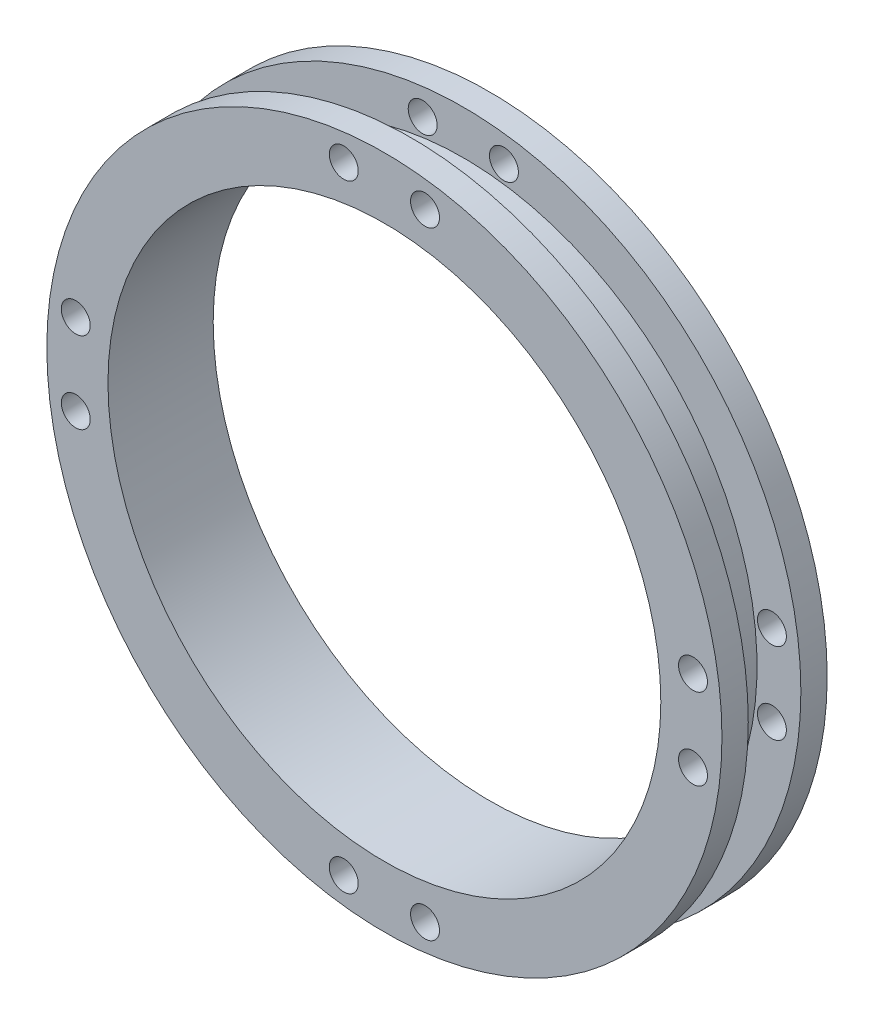
ISO-10303-21;
HEADER;
FILE_DESCRIPTION(('STEP AP214'),'2;1');
FILE_NAME('part.step','',(''),(''),'','','');
FILE_SCHEMA(('AUTOMOTIVE_DESIGN { 1 0 10303 214 1 1 1 1 }'));
ENDSEC;
DATA;
#1=APPLICATION_CONTEXT('core data for automotive mechanical design processes');
#2=APPLICATION_PROTOCOL_DEFINITION('international standard','automotive_design',2000,#1);
#3=PRODUCT_CONTEXT('',#1,'mechanical');
#4=PRODUCT('Part','Part','',(#3));
#5=PRODUCT_RELATED_PRODUCT_CATEGORY('part','',(#4));
#6=PRODUCT_DEFINITION_FORMATION('','',#4);
#7=PRODUCT_DEFINITION_CONTEXT('part definition',#1,'design');
#8=PRODUCT_DEFINITION('design','',#6,#7);
#9=PRODUCT_DEFINITION_SHAPE('','',#8);
#10=(LENGTH_UNIT() NAMED_UNIT(*) SI_UNIT(.MILLI.,.METRE.));
#11=(NAMED_UNIT(*) PLANE_ANGLE_UNIT() SI_UNIT($,.RADIAN.));
#12=(NAMED_UNIT(*) SI_UNIT($,.STERADIAN.) SOLID_ANGLE_UNIT());
#13=UNCERTAINTY_MEASURE_WITH_UNIT(LENGTH_MEASURE(1.E-05),#10,'distance_accuracy_value','');
#14=(GEOMETRIC_REPRESENTATION_CONTEXT(3) GLOBAL_UNCERTAINTY_ASSIGNED_CONTEXT((#13)) GLOBAL_UNIT_ASSIGNED_CONTEXT((#10,
#11,#12)) REPRESENTATION_CONTEXT('',''));
#15=CARTESIAN_POINT('',(0.,0.,0.));
#16=DIRECTION('',(0.,0.,1.));
#17=DIRECTION('',(1.,0.,0.));
#18=AXIS2_PLACEMENT_3D('',#15,#16,#17);
#19=CARTESIAN_POINT('',(0.,0.,9.));
#20=DIRECTION('',(0.,0.,1.));
#21=DIRECTION('',(1.,0.,0.));
#22=AXIS2_PLACEMENT_3D('',#19,#20,#21);
#23=PLANE('',#22);
#24=CARTESIAN_POINT('',(0.,0.,9.));
#25=DIRECTION('',(0.,0.,1.));
#26=DIRECTION('',(1.,0.,0.));
#27=AXIS2_PLACEMENT_3D('',#24,#25,#26);
#28=CIRCLE('',#27,31.525);
#29=CARTESIAN_POINT('',(31.525,0.,9.));
#30=VERTEX_POINT('',#29);
#31=EDGE_CURVE('E156',#30,#30,#28,.T.);
#32=ORIENTED_EDGE('',*,*,#31,.F.);
#33=EDGE_LOOP('',(#32));
#34=FACE_BOUND('',#33,.T.);
#35=CARTESIAN_POINT('',(-35.1962925787703,-4.63367982381147,9.));
#36=DIRECTION('',(0.,0.,-1.));
#37=DIRECTION('',(-1.,0.,0.));
#38=AXIS2_PLACEMENT_3D('',#35,#36,#37);
#39=CIRCLE('',#38,1.65);
#40=CARTESIAN_POINT('',(-36.8462925787703,-4.63367982381147,9.));
#41=VERTEX_POINT('',#40);
#42=EDGE_CURVE('E141',#41,#41,#39,.T.);
#43=ORIENTED_EDGE('',*,*,#42,.T.);
#44=EDGE_LOOP('',(#43));
#45=FACE_BOUND('',#44,.T.);
#46=CARTESIAN_POINT('',(-4.63367982381187,-35.1962925787703,9.));
#47=DIRECTION('',(0.,0.,-1.));
#48=DIRECTION('',(-1.,0.,0.));
#49=AXIS2_PLACEMENT_3D('',#46,#47,#48);
#50=CIRCLE('',#49,1.65);
#51=CARTESIAN_POINT('',(-6.28367982381186,-35.1962925787703,9.));
#52=VERTEX_POINT('',#51);
#53=EDGE_CURVE('E129',#52,#52,#50,.T.);
#54=ORIENTED_EDGE('',*,*,#53,.T.);
#55=EDGE_LOOP('',(#54));
#56=FACE_BOUND('',#55,.T.);
#57=CARTESIAN_POINT('',(4.63367982381184,-35.1962925787703,9.));
#58=DIRECTION('',(0.,0.,-1.));
#59=DIRECTION('',(-1.,0.,0.));
#60=AXIS2_PLACEMENT_3D('',#57,#58,#59);
#61=CIRCLE('',#60,1.65);
#62=CARTESIAN_POINT('',(2.98367982381184,-35.1962925787703,9.));
#63=VERTEX_POINT('',#62);
#64=EDGE_CURVE('E117',#63,#63,#61,.T.);
#65=ORIENTED_EDGE('',*,*,#64,.T.);
#66=EDGE_LOOP('',(#65));
#67=FACE_BOUND('',#66,.T.);
#68=CARTESIAN_POINT('',(35.1962925787703,-4.63367982381199,9.));
#69=DIRECTION('',(0.,0.,-1.));
#70=DIRECTION('',(-1.,0.,0.));
#71=AXIS2_PLACEMENT_3D('',#68,#69,#70);
#72=CIRCLE('',#71,1.65);
#73=CARTESIAN_POINT('',(33.5462925787702,-4.63367982381199,9.));
#74=VERTEX_POINT('',#73);
#75=EDGE_CURVE('E105',#74,#74,#72,.T.);
#76=ORIENTED_EDGE('',*,*,#75,.T.);
#77=EDGE_LOOP('',(#76));
#78=FACE_BOUND('',#77,.T.);
#79=CARTESIAN_POINT('',(35.1962925787703,4.63367982381172,9.));
#80=DIRECTION('',(0.,0.,-1.));
#81=DIRECTION('',(-1.,0.,0.));
#82=AXIS2_PLACEMENT_3D('',#79,#80,#81);
#83=CIRCLE('',#82,1.65);
#84=CARTESIAN_POINT('',(33.5462925787703,4.63367982381172,9.));
#85=VERTEX_POINT('',#84);
#86=EDGE_CURVE('E93',#85,#85,#83,.T.);
#87=ORIENTED_EDGE('',*,*,#86,.T.);
#88=EDGE_LOOP('',(#87));
#89=FACE_BOUND('',#88,.T.);
#90=CARTESIAN_POINT('',(4.63367982381187,35.1962925787703,9.));
#91=DIRECTION('',(0.,0.,-1.));
#92=DIRECTION('',(-1.,0.,0.));
#93=AXIS2_PLACEMENT_3D('',#90,#91,#92);
#94=CIRCLE('',#93,1.65);
#95=CARTESIAN_POINT('',(2.98367982381187,35.1962925787703,9.));
#96=VERTEX_POINT('',#95);
#97=EDGE_CURVE('E81',#96,#96,#94,.T.);
#98=ORIENTED_EDGE('',*,*,#97,.T.);
#99=EDGE_LOOP('',(#98));
#100=FACE_BOUND('',#99,.T.);
#101=CARTESIAN_POINT('',(-4.63367982381184,35.1962925787703,9.));
#102=DIRECTION('',(0.,0.,-1.));
#103=DIRECTION('',(-1.,0.,0.));
#104=AXIS2_PLACEMENT_3D('',#101,#102,#103);
#105=CIRCLE('',#104,1.65);
#106=CARTESIAN_POINT('',(-6.28367982381184,35.1962925787703,9.));
#107=VERTEX_POINT('',#106);
#108=EDGE_CURVE('E69',#107,#107,#105,.T.);
#109=ORIENTED_EDGE('',*,*,#108,.T.);
#110=EDGE_LOOP('',(#109));
#111=FACE_BOUND('',#110,.T.);
#112=CARTESIAN_POINT('',(0.,0.,9.));
#113=DIRECTION('',(0.,0.,1.));
#114=DIRECTION('',(1.,0.,0.));
#115=AXIS2_PLACEMENT_3D('',#112,#113,#114);
#116=CIRCLE('',#115,38.5);
#117=CARTESIAN_POINT('',(38.5,0.,9.));
#118=VERTEX_POINT('',#117);
#119=EDGE_CURVE('E58',#118,#118,#116,.T.);
#120=ORIENTED_EDGE('',*,*,#119,.T.);
#121=EDGE_LOOP('',(#120));
#122=FACE_BOUND('',#121,.T.);
#123=CARTESIAN_POINT('',(-35.1962925787702,4.63367982381223,9.));
#124=DIRECTION('',(0.,0.,-1.));
#125=DIRECTION('',(-1.,0.,0.));
#126=AXIS2_PLACEMENT_3D('',#123,#124,#125);
#127=CIRCLE('',#126,1.65);
#128=CARTESIAN_POINT('',(-36.8462925787702,4.63367982381223,9.));
#129=VERTEX_POINT('',#128);
#130=EDGE_CURVE('E150',#129,#129,#127,.T.);
#131=ORIENTED_EDGE('',*,*,#130,.T.);
#132=EDGE_LOOP('',(#131));
#133=FACE_BOUND('',#132,.T.);
#134=ADVANCED_FACE('F37',(#34,#45,#56,#67,#78,#89,#100,#111,#122,#133),#23,.T.);
#135=CARTESIAN_POINT('',(0.,0.,-3.));
#136=DIRECTION('',(0.,0.,1.));
#137=DIRECTION('',(1.,0.,0.));
#138=AXIS2_PLACEMENT_3D('',#135,#136,#137);
#139=PLANE('',#138);
#140=CARTESIAN_POINT('',(0.,0.,-3.));
#141=DIRECTION('',(0.,0.,-1.));
#142=DIRECTION('',(-1.,0.,0.));
#143=AXIS2_PLACEMENT_3D('',#140,#141,#142);
#144=CIRCLE('',#143,31.525);
#145=CARTESIAN_POINT('',(-31.525,0.,-3.));
#146=VERTEX_POINT('',#145);
#147=EDGE_CURVE('E159',#146,#146,#144,.T.);
#148=ORIENTED_EDGE('',*,*,#147,.F.);
#149=EDGE_LOOP('',(#148));
#150=FACE_BOUND('',#149,.T.);
#151=CARTESIAN_POINT('',(-35.1962925787703,-4.63367982381147,-3.));
#152=DIRECTION('',(0.,0.,-1.));
#153=DIRECTION('',(-1.,0.,0.));
#154=AXIS2_PLACEMENT_3D('',#151,#152,#153);
#155=CIRCLE('',#154,1.64999999999999);
#156=CARTESIAN_POINT('',(-36.8462925787703,-4.63367982381147,-3.));
#157=VERTEX_POINT('',#156);
#158=EDGE_CURVE('E144',#157,#157,#155,.T.);
#159=ORIENTED_EDGE('',*,*,#158,.F.);
#160=EDGE_LOOP('',(#159));
#161=FACE_BOUND('',#160,.T.);
#162=CARTESIAN_POINT('',(4.63367982381184,-35.1962925787703,-3.));
#163=DIRECTION('',(0.,0.,-1.));
#164=DIRECTION('',(-1.,0.,0.));
#165=AXIS2_PLACEMENT_3D('',#162,#163,#164);
#166=CIRCLE('',#165,1.64999999999999);
#167=CARTESIAN_POINT('',(2.98367982381185,-35.1962925787703,-3.));
#168=VERTEX_POINT('',#167);
#169=EDGE_CURVE('E120',#168,#168,#166,.T.);
#170=ORIENTED_EDGE('',*,*,#169,.F.);
#171=EDGE_LOOP('',(#170));
#172=FACE_BOUND('',#171,.T.);
#173=CARTESIAN_POINT('',(35.1962925787703,-4.63367982381199,-3.));
#174=DIRECTION('',(0.,0.,-1.));
#175=DIRECTION('',(-1.,0.,0.));
#176=AXIS2_PLACEMENT_3D('',#173,#174,#175);
#177=CIRCLE('',#176,1.64999999999999);
#178=CARTESIAN_POINT('',(33.5462925787703,-4.63367982381199,-3.));
#179=VERTEX_POINT('',#178);
#180=EDGE_CURVE('E108',#179,#179,#177,.T.);
#181=ORIENTED_EDGE('',*,*,#180,.F.);
#182=EDGE_LOOP('',(#181));
#183=FACE_BOUND('',#182,.T.);
#184=CARTESIAN_POINT('',(35.1962925787703,4.63367982381172,-3.));
#185=DIRECTION('',(0.,0.,-1.));
#186=DIRECTION('',(-1.,0.,0.));
#187=AXIS2_PLACEMENT_3D('',#184,#185,#186);
#188=CIRCLE('',#187,1.64999999999998);
#189=CARTESIAN_POINT('',(33.5462925787703,4.63367982381172,-3.));
#190=VERTEX_POINT('',#189);
#191=EDGE_CURVE('E96',#190,#190,#188,.T.);
#192=ORIENTED_EDGE('',*,*,#191,.F.);
#193=EDGE_LOOP('',(#192));
#194=FACE_BOUND('',#193,.T.);
#195=CARTESIAN_POINT('',(4.63367982381187,35.1962925787703,-3.));
#196=DIRECTION('',(0.,0.,-1.));
#197=DIRECTION('',(-1.,0.,0.));
#198=AXIS2_PLACEMENT_3D('',#195,#196,#197);
#199=CIRCLE('',#198,1.64999999999999);
#200=CARTESIAN_POINT('',(2.98367982381188,35.1962925787703,-3.));
#201=VERTEX_POINT('',#200);
#202=EDGE_CURVE('E84',#201,#201,#199,.T.);
#203=ORIENTED_EDGE('',*,*,#202,.F.);
#204=EDGE_LOOP('',(#203));
#205=FACE_BOUND('',#204,.T.);
#206=CARTESIAN_POINT('',(-4.63367982381184,35.1962925787703,-3.));
#207=DIRECTION('',(0.,0.,-1.));
#208=DIRECTION('',(-1.,0.,0.));
#209=AXIS2_PLACEMENT_3D('',#206,#207,#208);
#210=CIRCLE('',#209,1.64999999999999);
#211=CARTESIAN_POINT('',(-6.28367982381183,35.1962925787703,-3.));
#212=VERTEX_POINT('',#211);
#213=EDGE_CURVE('E72',#212,#212,#210,.T.);
#214=ORIENTED_EDGE('',*,*,#213,.F.);
#215=EDGE_LOOP('',(#214));
#216=FACE_BOUND('',#215,.T.);
#217=CARTESIAN_POINT('',(0.,0.,-3.));
#218=DIRECTION('',(0.,0.,-1.));
#219=DIRECTION('',(-1.,0.,0.));
#220=AXIS2_PLACEMENT_3D('',#217,#218,#219);
#221=CIRCLE('',#220,38.5);
#222=CARTESIAN_POINT('',(-38.5,0.,-3.));
#223=VERTEX_POINT('',#222);
#224=EDGE_CURVE('E52',#223,#223,#221,.T.);
#225=ORIENTED_EDGE('',*,*,#224,.T.);
#226=EDGE_LOOP('',(#225));
#227=FACE_BOUND('',#226,.T.);
#228=CARTESIAN_POINT('',(-4.63367982381187,-35.1962925787703,-3.));
#229=DIRECTION('',(0.,0.,-1.));
#230=DIRECTION('',(-1.,0.,0.));
#231=AXIS2_PLACEMENT_3D('',#228,#229,#230);
#232=CIRCLE('',#231,1.64999999999999);
#233=CARTESIAN_POINT('',(-6.28367982381185,-35.1962925787703,-3.));
#234=VERTEX_POINT('',#233);
#235=EDGE_CURVE('E132',#234,#234,#232,.T.);
#236=ORIENTED_EDGE('',*,*,#235,.F.);
#237=EDGE_LOOP('',(#236));
#238=FACE_BOUND('',#237,.T.);
#239=CARTESIAN_POINT('',(-35.1962925787702,4.63367982381223,-3.));
#240=DIRECTION('',(0.,0.,-1.));
#241=DIRECTION('',(-1.,0.,0.));
#242=AXIS2_PLACEMENT_3D('',#239,#240,#241);
#243=CIRCLE('',#242,1.64999999999998);
#244=CARTESIAN_POINT('',(-36.8462925787702,4.63367982381223,-3.));
#245=VERTEX_POINT('',#244);
#246=EDGE_CURVE('E153',#245,#245,#243,.T.);
#247=ORIENTED_EDGE('',*,*,#246,.F.);
#248=EDGE_LOOP('',(#247));
#249=FACE_BOUND('',#248,.T.);
#250=ADVANCED_FACE('F165',(#150,#161,#172,#183,#194,#205,#216,#227,#238,#249),#139,.F.);
#251=CARTESIAN_POINT('',(0.,0.,9.));
#252=DIRECTION('',(0.,0.,-1.));
#253=DIRECTION('',(-1.,0.,0.));
#254=AXIS2_PLACEMENT_3D('',#251,#252,#253);
#255=CYLINDRICAL_SURFACE('',#254,33.5);
#256=CARTESIAN_POINT('',(0.,0.,0.));
#257=DIRECTION('',(0.,0.,-1.));
#258=DIRECTION('',(-1.,0.,0.));
#259=AXIS2_PLACEMENT_3D('',#256,#257,#258);
#260=CIRCLE('',#259,33.5);
#261=CARTESIAN_POINT('',(-33.5,0.,0.));
#262=VERTEX_POINT('',#261);
#263=EDGE_CURVE('E45',#262,#262,#260,.T.);
#264=ORIENTED_EDGE('',*,*,#263,.F.);
#265=EDGE_LOOP('',(#264));
#266=FACE_BOUND('',#265,.T.);
#267=CARTESIAN_POINT('',(0.,0.,6.));
#268=DIRECTION('',(0.,0.,1.));
#269=DIRECTION('',(1.,0.,0.));
#270=AXIS2_PLACEMENT_3D('',#267,#268,#269);
#271=CIRCLE('',#270,33.5);
#272=CARTESIAN_POINT('',(33.5,0.,6.));
#273=VERTEX_POINT('',#272);
#274=EDGE_CURVE('E10',#273,#273,#271,.T.);
#275=ORIENTED_EDGE('',*,*,#274,.F.);
#276=EDGE_LOOP('',(#275));
#277=FACE_BOUND('',#276,.T.);
#278=ADVANCED_FACE('F39',(#266,#277),#255,.T.);
#279=CARTESIAN_POINT('',(0.,0.,0.));
#280=DIRECTION('',(0.,0.,-1.));
#281=DIRECTION('',(-1.,0.,0.));
#282=AXIS2_PLACEMENT_3D('',#279,#280,#281);
#283=CYLINDRICAL_SURFACE('',#282,38.5);
#284=CARTESIAN_POINT('',(0.,0.,0.));
#285=DIRECTION('',(0.,0.,-1.));
#286=DIRECTION('',(-1.,0.,0.));
#287=AXIS2_PLACEMENT_3D('',#284,#285,#286);
#288=CIRCLE('',#287,38.5);
#289=CARTESIAN_POINT('',(-38.5,0.,0.));
#290=VERTEX_POINT('',#289);
#291=EDGE_CURVE('E49',#290,#290,#288,.T.);
#292=ORIENTED_EDGE('',*,*,#291,.T.);
#293=EDGE_LOOP('',(#292));
#294=FACE_BOUND('',#293,.T.);
#295=ORIENTED_EDGE('',*,*,#224,.F.);
#296=EDGE_LOOP('',(#295));
#297=FACE_BOUND('',#296,.T.);
#298=ADVANCED_FACE('F198',(#294,#297),#283,.T.);
#299=CARTESIAN_POINT('',(0.,0.,0.));
#300=DIRECTION('',(0.,0.,-1.));
#301=DIRECTION('',(-1.,0.,0.));
#302=AXIS2_PLACEMENT_3D('',#299,#300,#301);
#303=PLANE('',#302);
#304=CARTESIAN_POINT('',(-35.1962925787702,4.63367982381223,0.));
#305=DIRECTION('',(0.,0.,-1.));
#306=DIRECTION('',(-1.,0.,0.));
#307=AXIS2_PLACEMENT_3D('',#304,#305,#306);
#308=CIRCLE('',#307,1.64999999999999);
#309=CARTESIAN_POINT('',(-36.8462925787702,4.63367982381223,0.));
#310=VERTEX_POINT('',#309);
#311=EDGE_CURVE('E147',#310,#310,#308,.T.);
#312=ORIENTED_EDGE('',*,*,#311,.T.);
#313=EDGE_LOOP('',(#312));
#314=FACE_BOUND('',#313,.T.);
#315=CARTESIAN_POINT('',(-35.1962925787703,-4.63367982381147,0.));
#316=DIRECTION('',(0.,0.,-1.));
#317=DIRECTION('',(-1.,0.,0.));
#318=AXIS2_PLACEMENT_3D('',#315,#316,#317);
#319=CIRCLE('',#318,1.65);
#320=CARTESIAN_POINT('',(-36.8462925787703,-4.63367982381147,0.));
#321=VERTEX_POINT('',#320);
#322=EDGE_CURVE('E138',#321,#321,#319,.T.);
#323=ORIENTED_EDGE('',*,*,#322,.T.);
#324=EDGE_LOOP('',(#323));
#325=FACE_BOUND('',#324,.T.);
#326=CARTESIAN_POINT('',(-4.63367982381187,-35.1962925787703,0.));
#327=DIRECTION('',(0.,0.,-1.));
#328=DIRECTION('',(-1.,0.,0.));
#329=AXIS2_PLACEMENT_3D('',#326,#327,#328);
#330=CIRCLE('',#329,1.64999999999999);
#331=CARTESIAN_POINT('',(-6.28367982381186,-35.1962925787703,0.));
#332=VERTEX_POINT('',#331);
#333=EDGE_CURVE('E123',#332,#332,#330,.T.);
#334=ORIENTED_EDGE('',*,*,#333,.T.);
#335=EDGE_LOOP('',(#334));
#336=FACE_BOUND('',#335,.T.);
#337=CARTESIAN_POINT('',(4.63367982381184,-35.1962925787703,0.));
#338=DIRECTION('',(0.,0.,-1.));
#339=DIRECTION('',(-1.,0.,0.));
#340=AXIS2_PLACEMENT_3D('',#337,#338,#339);
#341=CIRCLE('',#340,1.64999999999999);
#342=CARTESIAN_POINT('',(2.98367982381185,-35.1962925787703,0.));
#343=VERTEX_POINT('',#342);
#344=EDGE_CURVE('E111',#343,#343,#341,.T.);
#345=ORIENTED_EDGE('',*,*,#344,.T.);
#346=EDGE_LOOP('',(#345));
#347=FACE_BOUND('',#346,.T.);
#348=CARTESIAN_POINT('',(35.1962925787703,-4.63367982381199,0.));
#349=DIRECTION('',(0.,0.,-1.));
#350=DIRECTION('',(-1.,0.,0.));
#351=AXIS2_PLACEMENT_3D('',#348,#349,#350);
#352=CIRCLE('',#351,1.65);
#353=CARTESIAN_POINT('',(33.5462925787703,-4.63367982381199,0.));
#354=VERTEX_POINT('',#353);
#355=EDGE_CURVE('E99',#354,#354,#352,.T.);
#356=ORIENTED_EDGE('',*,*,#355,.T.);
#357=EDGE_LOOP('',(#356));
#358=FACE_BOUND('',#357,.T.);
#359=CARTESIAN_POINT('',(35.1962925787703,4.63367982381172,0.));
#360=DIRECTION('',(0.,0.,-1.));
#361=DIRECTION('',(-1.,0.,0.));
#362=AXIS2_PLACEMENT_3D('',#359,#360,#361);
#363=CIRCLE('',#362,1.64999999999999);
#364=CARTESIAN_POINT('',(33.5462925787703,4.63367982381172,0.));
#365=VERTEX_POINT('',#364);
#366=EDGE_CURVE('E87',#365,#365,#363,.T.);
#367=ORIENTED_EDGE('',*,*,#366,.T.);
#368=EDGE_LOOP('',(#367));
#369=FACE_BOUND('',#368,.T.);
#370=CARTESIAN_POINT('',(4.63367982381187,35.1962925787703,0.));
#371=DIRECTION('',(0.,0.,-1.));
#372=DIRECTION('',(-1.,0.,0.));
#373=AXIS2_PLACEMENT_3D('',#370,#371,#372);
#374=CIRCLE('',#373,1.64999999999999);
#375=CARTESIAN_POINT('',(2.98367982381187,35.1962925787703,0.));
#376=VERTEX_POINT('',#375);
#377=EDGE_CURVE('E78',#376,#376,#374,.T.);
#378=ORIENTED_EDGE('',*,*,#377,.T.);
#379=EDGE_LOOP('',(#378));
#380=FACE_BOUND('',#379,.T.);
#381=CARTESIAN_POINT('',(-4.63367982381184,35.1962925787703,0.));
#382=DIRECTION('',(0.,0.,-1.));
#383=DIRECTION('',(-1.,0.,0.));
#384=AXIS2_PLACEMENT_3D('',#381,#382,#383);
#385=CIRCLE('',#384,1.64999999999999);
#386=CARTESIAN_POINT('',(-6.28367982381183,35.1962925787703,0.));
#387=VERTEX_POINT('',#386);
#388=EDGE_CURVE('E61',#387,#387,#385,.T.);
#389=ORIENTED_EDGE('',*,*,#388,.T.);
#390=EDGE_LOOP('',(#389));
#391=FACE_BOUND('',#390,.T.);
#392=ORIENTED_EDGE('',*,*,#263,.T.);
#393=EDGE_LOOP('',(#392));
#394=FACE_BOUND('',#393,.T.);
#395=ORIENTED_EDGE('',*,*,#291,.F.);
#396=EDGE_LOOP('',(#395));
#397=FACE_BOUND('',#396,.T.);
#398=ADVANCED_FACE('F194',(#314,#325,#336,#347,#358,#369,#380,#391,#394,#397),#303,.F.);
#399=CARTESIAN_POINT('',(0.,0.,6.));
#400=DIRECTION('',(0.,0.,1.));
#401=DIRECTION('',(1.,0.,0.));
#402=AXIS2_PLACEMENT_3D('',#399,#400,#401);
#403=CYLINDRICAL_SURFACE('',#402,38.5);
#404=CARTESIAN_POINT('',(0.,0.,6.));
#405=DIRECTION('',(0.,0.,1.));
#406=DIRECTION('',(1.,0.,0.));
#407=AXIS2_PLACEMENT_3D('',#404,#405,#406);
#408=CIRCLE('',#407,38.5);
#409=CARTESIAN_POINT('',(38.5,0.,6.));
#410=VERTEX_POINT('',#409);
#411=EDGE_CURVE('E55',#410,#410,#408,.T.);
#412=ORIENTED_EDGE('',*,*,#411,.T.);
#413=EDGE_LOOP('',(#412));
#414=FACE_BOUND('',#413,.T.);
#415=ORIENTED_EDGE('',*,*,#119,.F.);
#416=EDGE_LOOP('',(#415));
#417=FACE_BOUND('',#416,.T.);
#418=ADVANCED_FACE('F197',(#414,#417),#403,.T.);
#419=CARTESIAN_POINT('',(0.,0.,6.));
#420=DIRECTION('',(0.,0.,1.));
#421=DIRECTION('',(1.,0.,0.));
#422=AXIS2_PLACEMENT_3D('',#419,#420,#421);
#423=PLANE('',#422);
#424=CARTESIAN_POINT('',(-35.1962925787702,4.63367982381223,6.));
#425=DIRECTION('',(0.,0.,1.));
#426=DIRECTION('',(1.,0.,0.));
#427=AXIS2_PLACEMENT_3D('',#424,#425,#426);
#428=CIRCLE('',#427,1.64999999999999);
#429=CARTESIAN_POINT('',(-33.5462925787702,4.63367982381223,6.));
#430=VERTEX_POINT('',#429);
#431=EDGE_CURVE('E41',#430,#430,#428,.T.);
#432=ORIENTED_EDGE('',*,*,#431,.T.);
#433=EDGE_LOOP('',(#432));
#434=FACE_BOUND('',#433,.T.);
#435=CARTESIAN_POINT('',(-35.1962925787703,-4.63367982381147,6.));
#436=DIRECTION('',(0.,0.,1.));
#437=DIRECTION('',(1.,0.,0.));
#438=AXIS2_PLACEMENT_3D('',#435,#436,#437);
#439=CIRCLE('',#438,1.65);
#440=CARTESIAN_POINT('',(-33.5462925787703,-4.63367982381147,6.));
#441=VERTEX_POINT('',#440);
#442=EDGE_CURVE('E135',#441,#441,#439,.T.);
#443=ORIENTED_EDGE('',*,*,#442,.T.);
#444=EDGE_LOOP('',(#443));
#445=FACE_BOUND('',#444,.T.);
#446=CARTESIAN_POINT('',(-4.63367982381187,-35.1962925787703,6.));
#447=DIRECTION('',(0.,0.,1.));
#448=DIRECTION('',(1.,0.,0.));
#449=AXIS2_PLACEMENT_3D('',#446,#447,#448);
#450=CIRCLE('',#449,1.64999999999999);
#451=CARTESIAN_POINT('',(-2.98367982381187,-35.1962925787703,6.));
#452=VERTEX_POINT('',#451);
#453=EDGE_CURVE('E126',#452,#452,#450,.T.);
#454=ORIENTED_EDGE('',*,*,#453,.T.);
#455=EDGE_LOOP('',(#454));
#456=FACE_BOUND('',#455,.T.);
#457=CARTESIAN_POINT('',(4.63367982381184,-35.1962925787703,6.));
#458=DIRECTION('',(0.,0.,1.));
#459=DIRECTION('',(1.,0.,0.));
#460=AXIS2_PLACEMENT_3D('',#457,#458,#459);
#461=CIRCLE('',#460,1.64999999999999);
#462=CARTESIAN_POINT('',(6.28367982381183,-35.1962925787703,6.));
#463=VERTEX_POINT('',#462);
#464=EDGE_CURVE('E114',#463,#463,#461,.T.);
#465=ORIENTED_EDGE('',*,*,#464,.T.);
#466=EDGE_LOOP('',(#465));
#467=FACE_BOUND('',#466,.T.);
#468=CARTESIAN_POINT('',(35.1962925787703,-4.63367982381199,6.));
#469=DIRECTION('',(0.,0.,1.));
#470=DIRECTION('',(1.,0.,0.));
#471=AXIS2_PLACEMENT_3D('',#468,#469,#470);
#472=CIRCLE('',#471,1.65);
#473=CARTESIAN_POINT('',(36.8462925787702,-4.63367982381199,6.));
#474=VERTEX_POINT('',#473);
#475=EDGE_CURVE('E102',#474,#474,#472,.T.);
#476=ORIENTED_EDGE('',*,*,#475,.T.);
#477=EDGE_LOOP('',(#476));
#478=FACE_BOUND('',#477,.T.);
#479=CARTESIAN_POINT('',(35.1962925787703,4.63367982381172,6.));
#480=DIRECTION('',(0.,0.,1.));
#481=DIRECTION('',(1.,0.,0.));
#482=AXIS2_PLACEMENT_3D('',#479,#480,#481);
#483=CIRCLE('',#482,1.64999999999999);
#484=CARTESIAN_POINT('',(36.8462925787703,4.63367982381172,6.));
#485=VERTEX_POINT('',#484);
#486=EDGE_CURVE('E90',#485,#485,#483,.T.);
#487=ORIENTED_EDGE('',*,*,#486,.T.);
#488=EDGE_LOOP('',(#487));
#489=FACE_BOUND('',#488,.T.);
#490=CARTESIAN_POINT('',(4.63367982381187,35.1962925787703,6.));
#491=DIRECTION('',(0.,0.,1.));
#492=DIRECTION('',(1.,0.,0.));
#493=AXIS2_PLACEMENT_3D('',#490,#491,#492);
#494=CIRCLE('',#493,1.64999999999999);
#495=CARTESIAN_POINT('',(6.28367982381186,35.1962925787703,6.));
#496=VERTEX_POINT('',#495);
#497=EDGE_CURVE('E75',#496,#496,#494,.T.);
#498=ORIENTED_EDGE('',*,*,#497,.T.);
#499=EDGE_LOOP('',(#498));
#500=FACE_BOUND('',#499,.T.);
#501=CARTESIAN_POINT('',(-4.63367982381184,35.1962925787703,6.));
#502=DIRECTION('',(0.,0.,1.));
#503=DIRECTION('',(1.,0.,0.));
#504=AXIS2_PLACEMENT_3D('',#501,#502,#503);
#505=CIRCLE('',#504,1.64999999999999);
#506=CARTESIAN_POINT('',(-2.98367982381185,35.1962925787703,6.));
#507=VERTEX_POINT('',#506);
#508=EDGE_CURVE('E66',#507,#507,#505,.T.);
#509=ORIENTED_EDGE('',*,*,#508,.T.);
#510=EDGE_LOOP('',(#509));
#511=FACE_BOUND('',#510,.T.);
#512=ORIENTED_EDGE('',*,*,#274,.T.);
#513=EDGE_LOOP('',(#512));
#514=FACE_BOUND('',#513,.T.);
#515=ORIENTED_EDGE('',*,*,#411,.F.);
#516=EDGE_LOOP('',(#515));
#517=FACE_BOUND('',#516,.T.);
#518=ADVANCED_FACE('F255',(#434,#445,#456,#467,#478,#489,#500,#511,#514,#517),#423,.F.);
#519=CARTESIAN_POINT('',(-4.63367982381184,35.1962925787703,-3.));
#520=DIRECTION('',(0.,0.,-1.));
#521=DIRECTION('',(-1.,0.,0.));
#522=AXIS2_PLACEMENT_3D('',#519,#520,#521);
#523=CYLINDRICAL_SURFACE('',#522,1.64999999999999);
#524=ORIENTED_EDGE('',*,*,#108,.F.);
#525=EDGE_LOOP('',(#524));
#526=FACE_BOUND('',#525,.T.);
#527=ORIENTED_EDGE('',*,*,#508,.F.);
#528=EDGE_LOOP('',(#527));
#529=FACE_BOUND('',#528,.T.);
#530=ADVANCED_FACE('F258',(#526,#529),#523,.F.);
#531=ORIENTED_EDGE('',*,*,#213,.T.);
#532=EDGE_LOOP('',(#531));
#533=FACE_BOUND('',#532,.T.);
#534=ORIENTED_EDGE('',*,*,#388,.F.);
#535=EDGE_LOOP('',(#534));
#536=FACE_BOUND('',#535,.T.);
#537=ADVANCED_FACE('F282',(#533,#536),#523,.F.);
#538=CARTESIAN_POINT('',(4.63367982381187,35.1962925787703,-3.));
#539=DIRECTION('',(0.,0.,-1.));
#540=DIRECTION('',(-1.,0.,0.));
#541=AXIS2_PLACEMENT_3D('',#538,#539,#540);
#542=CYLINDRICAL_SURFACE('',#541,1.64999999999999);
#543=ORIENTED_EDGE('',*,*,#97,.F.);
#544=EDGE_LOOP('',(#543));
#545=FACE_BOUND('',#544,.T.);
#546=ORIENTED_EDGE('',*,*,#497,.F.);
#547=EDGE_LOOP('',(#546));
#548=FACE_BOUND('',#547,.T.);
#549=ADVANCED_FACE('F285',(#545,#548),#542,.F.);
#550=ORIENTED_EDGE('',*,*,#202,.T.);
#551=EDGE_LOOP('',(#550));
#552=FACE_BOUND('',#551,.T.);
#553=ORIENTED_EDGE('',*,*,#377,.F.);
#554=EDGE_LOOP('',(#553));
#555=FACE_BOUND('',#554,.T.);
#556=ADVANCED_FACE('F289',(#552,#555),#542,.F.);
#557=CARTESIAN_POINT('',(35.1962925787703,4.63367982381172,-3.));
#558=DIRECTION('',(0.,0.,-1.));
#559=DIRECTION('',(-1.,0.,0.));
#560=AXIS2_PLACEMENT_3D('',#557,#558,#559);
#561=CYLINDRICAL_SURFACE('',#560,1.64999999999999);
#562=ORIENTED_EDGE('',*,*,#86,.F.);
#563=EDGE_LOOP('',(#562));
#564=FACE_BOUND('',#563,.T.);
#565=ORIENTED_EDGE('',*,*,#486,.F.);
#566=EDGE_LOOP('',(#565));
#567=FACE_BOUND('',#566,.T.);
#568=ADVANCED_FACE('F295',(#564,#567),#561,.F.);
#569=ORIENTED_EDGE('',*,*,#191,.T.);
#570=EDGE_LOOP('',(#569));
#571=FACE_BOUND('',#570,.T.);
#572=ORIENTED_EDGE('',*,*,#366,.F.);
#573=EDGE_LOOP('',(#572));
#574=FACE_BOUND('',#573,.T.);
#575=ADVANCED_FACE('F291',(#571,#574),#561,.F.);
#576=CARTESIAN_POINT('',(35.1962925787703,-4.63367982381199,-3.));
#577=DIRECTION('',(0.,0.,-1.));
#578=DIRECTION('',(-1.,0.,0.));
#579=AXIS2_PLACEMENT_3D('',#576,#577,#578);
#580=CYLINDRICAL_SURFACE('',#579,1.65);
#581=ORIENTED_EDGE('',*,*,#75,.F.);
#582=EDGE_LOOP('',(#581));
#583=FACE_BOUND('',#582,.T.);
#584=ORIENTED_EDGE('',*,*,#475,.F.);
#585=EDGE_LOOP('',(#584));
#586=FACE_BOUND('',#585,.T.);
#587=ADVANCED_FACE('F294',(#583,#586),#580,.F.);
#588=ORIENTED_EDGE('',*,*,#180,.T.);
#589=EDGE_LOOP('',(#588));
#590=FACE_BOUND('',#589,.T.);
#591=ORIENTED_EDGE('',*,*,#355,.F.);
#592=EDGE_LOOP('',(#591));
#593=FACE_BOUND('',#592,.T.);
#594=ADVANCED_FACE('F297',(#590,#593),#580,.F.);
#595=CARTESIAN_POINT('',(4.63367982381184,-35.1962925787703,-3.));
#596=DIRECTION('',(0.,0.,-1.));
#597=DIRECTION('',(-1.,0.,0.));
#598=AXIS2_PLACEMENT_3D('',#595,#596,#597);
#599=CYLINDRICAL_SURFACE('',#598,1.64999999999999);
#600=ORIENTED_EDGE('',*,*,#64,.F.);
#601=EDGE_LOOP('',(#600));
#602=FACE_BOUND('',#601,.T.);
#603=ORIENTED_EDGE('',*,*,#464,.F.);
#604=EDGE_LOOP('',(#603));
#605=FACE_BOUND('',#604,.T.);
#606=ADVANCED_FACE('F300',(#602,#605),#599,.F.);
#607=ORIENTED_EDGE('',*,*,#169,.T.);
#608=EDGE_LOOP('',(#607));
#609=FACE_BOUND('',#608,.T.);
#610=ORIENTED_EDGE('',*,*,#344,.F.);
#611=EDGE_LOOP('',(#610));
#612=FACE_BOUND('',#611,.T.);
#613=ADVANCED_FACE('F302',(#609,#612),#599,.F.);
#614=CARTESIAN_POINT('',(-4.63367982381187,-35.1962925787703,-3.));
#615=DIRECTION('',(0.,0.,-1.));
#616=DIRECTION('',(-1.,0.,0.));
#617=AXIS2_PLACEMENT_3D('',#614,#615,#616);
#618=CYLINDRICAL_SURFACE('',#617,1.64999999999999);
#619=ORIENTED_EDGE('',*,*,#53,.F.);
#620=EDGE_LOOP('',(#619));
#621=FACE_BOUND('',#620,.T.);
#622=ORIENTED_EDGE('',*,*,#453,.F.);
#623=EDGE_LOOP('',(#622));
#624=FACE_BOUND('',#623,.T.);
#625=ADVANCED_FACE('F305',(#621,#624),#618,.F.);
#626=ORIENTED_EDGE('',*,*,#235,.T.);
#627=EDGE_LOOP('',(#626));
#628=FACE_BOUND('',#627,.T.);
#629=ORIENTED_EDGE('',*,*,#333,.F.);
#630=EDGE_LOOP('',(#629));
#631=FACE_BOUND('',#630,.T.);
#632=ADVANCED_FACE('F307',(#628,#631),#618,.F.);
#633=CARTESIAN_POINT('',(-35.1962925787703,-4.63367982381147,-3.));
#634=DIRECTION('',(0.,0.,-1.));
#635=DIRECTION('',(-1.,0.,0.));
#636=AXIS2_PLACEMENT_3D('',#633,#634,#635);
#637=CYLINDRICAL_SURFACE('',#636,1.65);
#638=ORIENTED_EDGE('',*,*,#42,.F.);
#639=EDGE_LOOP('',(#638));
#640=FACE_BOUND('',#639,.T.);
#641=ORIENTED_EDGE('',*,*,#442,.F.);
#642=EDGE_LOOP('',(#641));
#643=FACE_BOUND('',#642,.T.);
#644=ADVANCED_FACE('F310',(#640,#643),#637,.F.);
#645=ORIENTED_EDGE('',*,*,#158,.T.);
#646=EDGE_LOOP('',(#645));
#647=FACE_BOUND('',#646,.T.);
#648=ORIENTED_EDGE('',*,*,#322,.F.);
#649=EDGE_LOOP('',(#648));
#650=FACE_BOUND('',#649,.T.);
#651=ADVANCED_FACE('F251',(#647,#650),#637,.F.);
#652=CARTESIAN_POINT('',(-35.1962925787702,4.63367982381223,-3.));
#653=DIRECTION('',(0.,0.,-1.));
#654=DIRECTION('',(-1.,0.,0.));
#655=AXIS2_PLACEMENT_3D('',#652,#653,#654);
#656=CYLINDRICAL_SURFACE('',#655,1.64999999999999);
#657=ORIENTED_EDGE('',*,*,#130,.F.);
#658=EDGE_LOOP('',(#657));
#659=FACE_BOUND('',#658,.T.);
#660=ORIENTED_EDGE('',*,*,#431,.F.);
#661=EDGE_LOOP('',(#660));
#662=FACE_BOUND('',#661,.T.);
#663=ADVANCED_FACE('F190',(#659,#662),#656,.F.);
#664=ORIENTED_EDGE('',*,*,#246,.T.);
#665=EDGE_LOOP('',(#664));
#666=FACE_BOUND('',#665,.T.);
#667=ORIENTED_EDGE('',*,*,#311,.F.);
#668=EDGE_LOOP('',(#667));
#669=FACE_BOUND('',#668,.T.);
#670=ADVANCED_FACE('F187',(#666,#669),#656,.F.);
#671=CARTESIAN_POINT('',(0.,0.,9.));
#672=DIRECTION('',(0.,0.,-1.));
#673=DIRECTION('',(-1.,0.,0.));
#674=AXIS2_PLACEMENT_3D('',#671,#672,#673);
#675=CYLINDRICAL_SURFACE('',#674,31.525);
#676=ORIENTED_EDGE('',*,*,#31,.T.);
#677=EDGE_LOOP('',(#676));
#678=FACE_BOUND('',#677,.T.);
#679=ORIENTED_EDGE('',*,*,#147,.T.);
#680=EDGE_LOOP('',(#679));
#681=FACE_BOUND('',#680,.T.);
#682=ADVANCED_FACE('F163',(#678,#681),#675,.F.);
#683=CLOSED_SHELL('',(#134,#250,#278,#298,#398,#418,#518,#530,#537,#549,#556,#568,#575,#587,
#594,#606,#613,#625,#632,#644,#651,#663,#670,#682));
#684=MANIFOLD_SOLID_BREP('B2',#683);
#685=ADVANCED_BREP_SHAPE_REPRESENTATION('',(#18,#684),#14);
#686=SHAPE_DEFINITION_REPRESENTATION(#9,#685);
ENDSEC;
END-ISO-10303-21;
